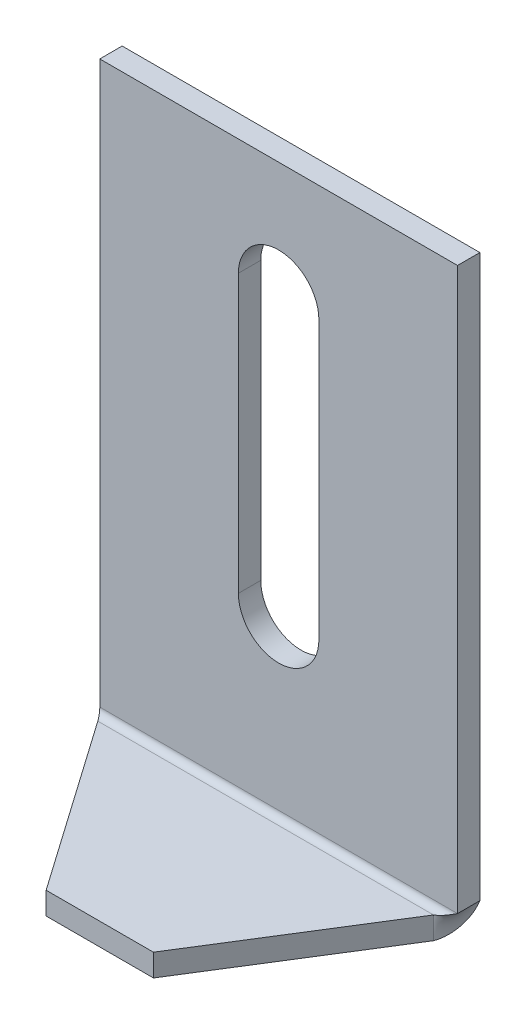
ISO-10303-21;
HEADER;
FILE_DESCRIPTION(('STEP AP214'),'2;1');
FILE_NAME('part.step','',(''),(''),'','','');
FILE_SCHEMA(('AUTOMOTIVE_DESIGN { 1 0 10303 214 1 1 1 1 }'));
ENDSEC;
DATA;
#1=APPLICATION_CONTEXT('core data for automotive mechanical design processes');
#2=APPLICATION_PROTOCOL_DEFINITION('international standard','automotive_design',2000,#1);
#3=PRODUCT_CONTEXT('',#1,'mechanical');
#4=PRODUCT('Part','Part','',(#3));
#5=PRODUCT_RELATED_PRODUCT_CATEGORY('part','',(#4));
#6=PRODUCT_DEFINITION_FORMATION('','',#4);
#7=PRODUCT_DEFINITION_CONTEXT('part definition',#1,'design');
#8=PRODUCT_DEFINITION('design','',#6,#7);
#9=PRODUCT_DEFINITION_SHAPE('','',#8);
#10=(LENGTH_UNIT() NAMED_UNIT(*) SI_UNIT(.MILLI.,.METRE.));
#11=(NAMED_UNIT(*) PLANE_ANGLE_UNIT() SI_UNIT($,.RADIAN.));
#12=(NAMED_UNIT(*) SI_UNIT($,.STERADIAN.) SOLID_ANGLE_UNIT());
#13=UNCERTAINTY_MEASURE_WITH_UNIT(LENGTH_MEASURE(1.E-05),#10,'distance_accuracy_value','');
#14=(GEOMETRIC_REPRESENTATION_CONTEXT(3) GLOBAL_UNCERTAINTY_ASSIGNED_CONTEXT((#13)) GLOBAL_UNIT_ASSIGNED_CONTEXT((#10,
#11,#12)) REPRESENTATION_CONTEXT('',''));
#15=CARTESIAN_POINT('',(0.,0.,0.));
#16=DIRECTION('',(0.,0.,1.));
#17=DIRECTION('',(1.,0.,0.));
#18=AXIS2_PLACEMENT_3D('',#15,#16,#17);
#19=CARTESIAN_POINT('',(20.,-29.7634,0.7366));
#20=DIRECTION('',(1.,0.,0.));
#21=DIRECTION('',(0.,-1.,0.));
#22=AXIS2_PLACEMENT_3D('',#19,#20,#21);
#23=CYLINDRICAL_SURFACE('',#22,3.2366);
#24=DIRECTION('',(1.,0.,0.));
#25=VECTOR('',#24,1.);
#26=CARTESIAN_POINT('',(20.,-29.7634,-2.5));
#27=LINE('',#26,#25);
#28=CARTESIAN_POINT('',(20.,-29.7634,-2.5));
#29=VERTEX_POINT('',#28);
#30=CARTESIAN_POINT('',(-20.,-29.7634,-2.5));
#31=VERTEX_POINT('',#30);
#32=EDGE_CURVE('E323',#29,#31,#27,.F.);
#33=ORIENTED_EDGE('',*,*,#32,.F.);
#34=CARTESIAN_POINT('',(20.,-29.7634,-2.5));
#35=CARTESIAN_POINT('',(19.9615623074783,-29.8635206752206,-2.50001434722235));
#36=CARTESIAN_POINT('',(19.9231257163744,-29.9636396314822,-2.49535493747329));
#37=CARTESIAN_POINT('',(19.8462557223941,-30.1630139688057,-2.47679174832859));
#38=CARTESIAN_POINT('',(19.8078223194519,-30.262269382968,-2.46288832486156));
#39=CARTESIAN_POINT('',(19.7309971081431,-30.4589609556835,-2.42595964820672));
#40=CARTESIAN_POINT('',(19.6926052985018,-30.5563989161265,-2.40294399452095));
#41=CARTESIAN_POINT('',(19.6158195325325,-30.7487216933464,-2.34799402211207));
#42=CARTESIAN_POINT('',(19.5774255763525,-30.843606612373,-2.31606006115319));
#43=CARTESIAN_POINT('',(19.5015950327425,-31.0276906188389,-2.2444500018259));
#44=CARTESIAN_POINT('',(19.4641584072125,-31.116972449602,-2.20498644045154));
#45=CARTESIAN_POINT('',(19.3892722432459,-31.2916417879416,-2.11814558430977));
#46=CARTESIAN_POINT('',(19.3518227049898,-31.3770278884105,-2.07076545850092));
#47=CARTESIAN_POINT('',(19.2769518866024,-31.5431166859465,-1.96852316681954));
#48=CARTESIAN_POINT('',(19.2395306046696,-31.6238225477047,-1.91366614279858));
#49=CARTESIAN_POINT('',(19.1646718685881,-31.7799812156769,-1.79687382559493));
#50=CARTESIAN_POINT('',(19.1272344133318,-31.8554321903026,-1.73493608410411));
#51=CARTESIAN_POINT('',(19.0523699753119,-32.0004148574565,-1.60452117556803));
#52=CARTESIAN_POINT('',(19.0149429925595,-32.0699482061477,-1.53604584965226));
#53=CARTESIAN_POINT('',(18.9400886227628,-32.2025518867596,-1.39309998730571));
#54=CARTESIAN_POINT('',(18.9026612357184,-32.2656222182564,-1.31862945048172));
#55=CARTESIAN_POINT('',(18.8277846861459,-32.3848260651348,-1.16424771158406));
#56=CARTESIAN_POINT('',(18.7903355258826,-32.4409548913771,-1.08433288768441));
#57=CARTESIAN_POINT('',(18.7154486080126,-32.5457481709002,-0.919790334514382));
#58=CARTESIAN_POINT('',(18.6780108509663,-32.5944152115861,-0.835164252830076));
#59=CARTESIAN_POINT('',(18.6030999647303,-32.6839514540244,-0.661787113500573));
#60=CARTESIAN_POINT('',(18.5656268340308,-32.7248135981518,-0.573032411848724));
#61=CARTESIAN_POINT('',(18.4906941624865,-32.7983379503189,-0.392227419429467));
#62=CARTESIAN_POINT('',(18.4532346218087,-32.8310032240005,-0.300178375512506));
#63=CARTESIAN_POINT('',(18.3783619110252,-32.8878542268053,-0.113614675891605));
#64=CARTESIAN_POINT('',(18.3409487369194,-32.9120496186919,-0.0191029628803435));
#65=CARTESIAN_POINT('',(18.2661377229835,-32.951806110206,0.171680786222593));
#66=CARTESIAN_POINT('',(18.2287398845504,-32.9673714055,0.267951943373622));
#67=CARTESIAN_POINT('',(18.1674788051567,-32.9857079667507,0.426473120620318));
#68=CARTESIAN_POINT('',(18.1436126567985,-32.9910704641397,0.48843395752415));
#69=CARTESIAN_POINT('',(18.0959187523188,-32.99821413809,0.612461043762688));
#70=CARTESIAN_POINT('',(18.0720909965556,-33.0000010949367,0.674526960353037));
#71=CARTESIAN_POINT('',(18.0482610306343,-33.,0.73660000000001));
#72=B_SPLINE_CURVE_WITH_KNOTS('',3,(#34,#35,#36,#37,#38,#39,#40,#41,#42,#43,#44,#45,#46,#47,#48,
#49,#50,#51,#52,#53,#54,#55,#56,#57,#58,#59,#60,#61,#62,#63,#64,#65,#66,#67,#68,#69,#70,#71),
.UNSPECIFIED.,.F.,.F.,(4,2,2,2,2,2,2,2,2,2,2,2,2,2,2,2,2,2,4),(0.,0.321632700777931,
0.643253018228255,0.964535414602611,1.28580492435662,1.59907625550871,1.91245985629269,
2.22562902092769,2.53890679983774,2.85209661153469,3.16528644377296,3.47868670020702,
3.79197803682578,4.10555134159481,4.41900719409226,4.73210426980757,5.04504899434633,
5.24480361178085,5.44423504042591),.UNSPECIFIED.);
#73=CARTESIAN_POINT('',(18.0482610306343,-33.,0.736600000000007));
#74=VERTEX_POINT('',#73);
#75=EDGE_CURVE('E181',#29,#74,#72,.T.);
#76=ORIENTED_EDGE('',*,*,#75,.T.);
#77=DIRECTION('',(1.,0.,0.));
#78=VECTOR('',#77,1.);
#79=CARTESIAN_POINT('',(-20.,-33.,0.736599999999988));
#80=LINE('',#79,#78);
#81=CARTESIAN_POINT('',(-19.48438,-33.,0.736599999999988));
#82=VERTEX_POINT('',#81);
#83=EDGE_CURVE('E311',#74,#82,#80,.F.);
#84=ORIENTED_EDGE('',*,*,#83,.T.);
#85=CARTESIAN_POINT('',(-19.48438,-29.7634,0.7366));
#86=DIRECTION('',(0.98754684235154,0.,-0.157325249599364));
#87=DIRECTION('',(0.157325249599364,0.,0.98754684235154));
#88=AXIS2_PLACEMENT_3D('',#85,#86,#87);
#89=ELLIPSE('',#88,3.27741415515342,3.2366);
#90=EDGE_CURVE('E341',#31,#82,#89,.F.);
#91=ORIENTED_EDGE('',*,*,#90,.F.);
#92=EDGE_LOOP('',(#33,#76,#84,#91));
#93=FACE_BOUND('',#92,.T.);
#94=ADVANCED_FACE('F58',(#93),#23,.T.);
#95=CARTESIAN_POINT('',(20.,-29.7634,0.7366));
#96=DIRECTION('',(1.,0.,0.));
#97=DIRECTION('',(0.,-1.,0.));
#98=AXIS2_PLACEMENT_3D('',#95,#96,#97);
#99=CYLINDRICAL_SURFACE('',#98,0.7366);
#100=CARTESIAN_POINT('',(20.,-29.7634,0.));
#101=CARTESIAN_POINT('',(19.9310524712027,-29.804276808167,-3.40600880367663E-05));
#102=CARTESIAN_POINT('',(19.8621064379867,-29.8451463476469,0.00340052086237688));
#103=CARTESIAN_POINT('',(19.7242256496072,-29.9257551094893,0.0169633811287723));
#104=CARTESIAN_POINT('',(19.6552908943644,-29.9654945074389,0.0270906146336669));
#105=CARTESIAN_POINT('',(19.5175536439035,-30.0426654622591,0.0537693367474229));
#106=CARTESIAN_POINT('',(19.4487511525299,-30.0801013624259,0.0703082772177428));
#107=CARTESIAN_POINT('',(19.3111544757805,-30.1517247501937,0.109347590895923));
#108=CARTESIAN_POINT('',(19.2423602901782,-30.1859124946601,0.131847492174927));
#109=CARTESIAN_POINT('',(19.1043588210408,-30.2502850760953,0.182338114696372));
#110=CARTESIAN_POINT('',(19.0351515196128,-30.2804448360086,0.210360768297003));
#111=CARTESIAN_POINT('',(18.8967386595313,-30.3356857081223,0.271034207694493));
#112=CARTESIAN_POINT('',(18.827533100874,-30.360766832386,0.30368498249786));
#113=CARTESIAN_POINT('',(18.689258170966,-30.4051048084741,0.372633775244736));
#114=CARTESIAN_POINT('',(18.6201887983694,-30.4243729676954,0.408924526957045));
#115=CARTESIAN_POINT('',(18.4820768903853,-30.456610819514,0.484185384271051));
#116=CARTESIAN_POINT('',(18.4130343576726,-30.4695834732213,0.523154220361849));
#117=CARTESIAN_POINT('',(18.2946987051323,-30.4861245346357,0.591330268276077));
#118=CARTESIAN_POINT('',(18.2454003544586,-30.4913210123019,0.620144539788254));
#119=CARTESIAN_POINT('',(18.1468237529499,-30.4982619511991,0.678171957847934));
#120=CARTESIAN_POINT('',(18.0975455024463,-30.5000078737198,0.707384930268018));
#121=CARTESIAN_POINT('',(18.0482610306343,-30.5,0.736600000000002));
#122=B_SPLINE_CURVE_WITH_KNOTS('',3,(#100,#101,#102,#103,#104,#105,#106,#107,#108,#109,#110,
#111,#112,#113,#114,#115,#116,#117,#118,#119,#120,#121),.UNSPECIFIED.,.F.,.F.,(4,2,2,2,2,2,2,2,
2,2,4),(0.,0.240381665537412,0.480725777297071,0.720601874987007,0.960458987374965,
1.2017459376617,1.44303231481264,1.68384626897519,1.92454684551892,2.09645954323323,
2.26829942132417),.UNSPECIFIED.);
#123=CARTESIAN_POINT('',(20.,-29.7634,0.));
#124=VERTEX_POINT('',#123);
#125=CARTESIAN_POINT('',(18.0482610306343,-30.5,0.73660000000001));
#126=VERTEX_POINT('',#125);
#127=EDGE_CURVE('E198',#124,#126,#122,.T.);
#128=ORIENTED_EDGE('',*,*,#127,.F.);
#129=DIRECTION('',(1.,0.,0.));
#130=VECTOR('',#129,1.);
#131=CARTESIAN_POINT('',(20.,-29.7634,0.));
#132=LINE('',#131,#130);
#133=CARTESIAN_POINT('',(-20.,-29.7634,0.));
#134=VERTEX_POINT('',#133);
#135=EDGE_CURVE('E327',#124,#134,#132,.F.);
#136=ORIENTED_EDGE('',*,*,#135,.T.);
#137=CARTESIAN_POINT('',(-19.48438,-29.7634,0.7366));
#138=DIRECTION('',(0.819231920519041,0.,-0.573462344363328));
#139=DIRECTION('',(0.573462344363328,0.,0.819231920519041));
#140=AXIS2_PLACEMENT_3D('',#137,#138,#139);
#141=ELLIPSE('',#140,0.899134886654945,0.7366);
#142=CARTESIAN_POINT('',(-19.48438,-30.5,0.736599999999997));
#143=VERTEX_POINT('',#142);
#144=EDGE_CURVE('E184',#134,#143,#141,.F.);
#145=ORIENTED_EDGE('',*,*,#144,.T.);
#146=DIRECTION('',(1.,0.,0.));
#147=VECTOR('',#146,1.);
#148=CARTESIAN_POINT('',(-20.,-30.5,0.736599999999997));
#149=LINE('',#148,#147);
#150=EDGE_CURVE('E319',#143,#126,#149,.T.);
#151=ORIENTED_EDGE('',*,*,#150,.T.);
#152=EDGE_LOOP('',(#128,#136,#145,#151));
#153=FACE_BOUND('',#152,.T.);
#154=ADVANCED_FACE('F250',(#153),#99,.F.);
#155=CARTESIAN_POINT('',(0.,-33.,-1.23220452761577E-13));
#156=DIRECTION('',(0.,1.,0.));
#157=DIRECTION('',(0.,0.,1.));
#158=AXIS2_PLACEMENT_3D('',#155,#156,#157);
#159=PLANE('',#158);
#160=DIRECTION('',(0.530272237036283,0.,-0.847827432104279));
#161=VECTOR('',#160,1.);
#162=CARTESIAN_POINT('',(5.99999999999999,-32.9999999999999,20.));
#163=LINE('',#162,#161);
#164=CARTESIAN_POINT('',(6.00000000000001,-33.0000000000001,20.));
#165=VERTEX_POINT('',#164);
#166=EDGE_CURVE('E193',#165,#74,#163,.T.);
#167=ORIENTED_EDGE('',*,*,#166,.F.);
#168=DIRECTION('',(-1.,0.,0.));
#169=VECTOR('',#168,1.);
#170=CARTESIAN_POINT('',(0.,-33.0000000000001,20.));
#171=LINE('',#170,#169);
#172=CARTESIAN_POINT('',(-6.00000000000001,-33.0000000000001,20.));
#173=VERTEX_POINT('',#172);
#174=EDGE_CURVE('E310',#165,#173,#171,.T.);
#175=ORIENTED_EDGE('',*,*,#174,.T.);
#176=DIRECTION('',(-0.573462344363328,0.,-0.819231920519041));
#177=VECTOR('',#176,1.);
#178=CARTESIAN_POINT('',(-13.4228187919464,-33.,9.39597315436233));
#179=LINE('',#178,#177);
#180=EDGE_CURVE('E175',#173,#82,#179,.T.);
#181=ORIENTED_EDGE('',*,*,#180,.T.);
#182=ORIENTED_EDGE('',*,*,#83,.F.);
#183=EDGE_LOOP('',(#167,#175,#181,#182));
#184=FACE_BOUND('',#183,.T.);
#185=ADVANCED_FACE('F256',(#184),#159,.F.);
#186=CARTESIAN_POINT('',(0.,-30.5,-1.14491749414469E-13));
#187=DIRECTION('',(0.,1.,0.));
#188=DIRECTION('',(0.,0.,1.));
#189=AXIS2_PLACEMENT_3D('',#186,#187,#188);
#190=PLANE('',#189);
#191=DIRECTION('',(1.,0.,0.));
#192=VECTOR('',#191,1.);
#193=CARTESIAN_POINT('',(-20.,-30.5000000000001,20.));
#194=LINE('',#193,#192);
#195=CARTESIAN_POINT('',(6.00000000000001,-30.5000000000001,20.));
#196=VERTEX_POINT('',#195);
#197=CARTESIAN_POINT('',(-6.00000000000001,-30.5000000000001,20.));
#198=VERTEX_POINT('',#197);
#199=EDGE_CURVE('E306',#196,#198,#194,.F.);
#200=ORIENTED_EDGE('',*,*,#199,.F.);
#201=DIRECTION('',(0.530272237036283,0.,-0.847827432104279));
#202=VECTOR('',#201,1.);
#203=CARTESIAN_POINT('',(5.99999999999999,-30.4999999999999,20.));
#204=LINE('',#203,#202);
#205=EDGE_CURVE('E185',#196,#126,#204,.T.);
#206=ORIENTED_EDGE('',*,*,#205,.T.);
#207=ORIENTED_EDGE('',*,*,#150,.F.);
#208=DIRECTION('',(-0.573462344363328,0.,-0.819231920519041));
#209=VECTOR('',#208,1.);
#210=CARTESIAN_POINT('',(-13.4228187919464,-30.5,9.39597315436234));
#211=LINE('',#210,#209);
#212=EDGE_CURVE('E179',#198,#143,#211,.T.);
#213=ORIENTED_EDGE('',*,*,#212,.F.);
#214=EDGE_LOOP('',(#200,#206,#207,#213));
#215=FACE_BOUND('',#214,.T.);
#216=ADVANCED_FACE('F352',(#215),#190,.T.);
#217=CARTESIAN_POINT('',(-20.,-33.0000000000001,20.));
#218=DIRECTION('',(0.,0.,-1.));
#219=DIRECTION('',(0.,1.,0.));
#220=AXIS2_PLACEMENT_3D('',#217,#218,#219);
#221=PLANE('',#220);
#222=DIRECTION('',(0.,-1.,0.));
#223=VECTOR('',#222,1.);
#224=CARTESIAN_POINT('',(5.99999999999999,-33.0000000000001,20.));
#225=LINE('',#224,#223);
#226=EDGE_CURVE('E188',#165,#196,#225,.F.);
#227=ORIENTED_EDGE('',*,*,#226,.T.);
#228=ORIENTED_EDGE('',*,*,#199,.T.);
#229=DIRECTION('',(0.,1.,0.));
#230=VECTOR('',#229,1.);
#231=CARTESIAN_POINT('',(-6.00000000000001,-33.0000000000001,20.));
#232=LINE('',#231,#230);
#233=EDGE_CURVE('E178',#198,#173,#232,.F.);
#234=ORIENTED_EDGE('',*,*,#233,.T.);
#235=ORIENTED_EDGE('',*,*,#174,.F.);
#236=EDGE_LOOP('',(#227,#228,#234,#235));
#237=FACE_BOUND('',#236,.T.);
#238=ADVANCED_FACE('F261',(#237),#221,.F.);
#239=CARTESIAN_POINT('',(20.,-33.,-2.5));
#240=DIRECTION('',(1.,0.,0.));
#241=DIRECTION('',(0.,0.,-1.));
#242=AXIS2_PLACEMENT_3D('',#239,#240,#241);
#243=PLANE('',#242);
#244=DIRECTION('',(0.,1.,0.));
#245=VECTOR('',#244,1.);
#246=CARTESIAN_POINT('',(20.,-33.,0.));
#247=LINE('',#246,#245);
#248=CARTESIAN_POINT('',(20.,33.,0.));
#249=VERTEX_POINT('',#248);
#250=EDGE_CURVE('E294',#124,#249,#247,.T.);
#251=ORIENTED_EDGE('',*,*,#250,.F.);
#252=DIRECTION('',(0.,0.,-1.));
#253=VECTOR('',#252,1.);
#254=CARTESIAN_POINT('',(20.,-29.7634,0.));
#255=LINE('',#254,#253);
#256=EDGE_CURVE('E326',#124,#29,#255,.T.);
#257=ORIENTED_EDGE('',*,*,#256,.T.);
#258=DIRECTION('',(0.,1.,0.));
#259=VECTOR('',#258,1.);
#260=CARTESIAN_POINT('',(20.,-33.,-2.5));
#261=LINE('',#260,#259);
#262=CARTESIAN_POINT('',(20.,33.,-2.5));
#263=VERTEX_POINT('',#262);
#264=EDGE_CURVE('E296',#29,#263,#261,.T.);
#265=ORIENTED_EDGE('',*,*,#264,.T.);
#266=DIRECTION('',(0.,0.,1.));
#267=VECTOR('',#266,1.);
#268=CARTESIAN_POINT('',(20.,33.,-2.5));
#269=LINE('',#268,#267);
#270=EDGE_CURVE('E287',#263,#249,#269,.T.);
#271=ORIENTED_EDGE('',*,*,#270,.T.);
#272=EDGE_LOOP('',(#251,#257,#265,#271));
#273=FACE_BOUND('',#272,.T.);
#274=ADVANCED_FACE('F60',(#273),#243,.T.);
#275=CARTESIAN_POINT('',(0.,0.,-2.5));
#276=DIRECTION('',(0.,0.,-1.));
#277=DIRECTION('',(-1.,0.,0.));
#278=AXIS2_PLACEMENT_3D('',#275,#276,#277);
#279=PLANE('',#278);
#280=CARTESIAN_POINT('',(0.,20.,-2.5));
#281=DIRECTION('',(0.,0.,1.));
#282=DIRECTION('',(1.,0.,0.));
#283=AXIS2_PLACEMENT_3D('',#280,#281,#282);
#284=CIRCLE('',#283,4.5);
#285=CARTESIAN_POINT('',(4.5,20.,-2.5));
#286=VERTEX_POINT('',#285);
#287=CARTESIAN_POINT('',(-4.5,20.,-2.5));
#288=VERTEX_POINT('',#287);
#289=EDGE_CURVE('E150',#286,#288,#284,.T.);
#290=ORIENTED_EDGE('',*,*,#289,.T.);
#291=DIRECTION('',(0.,-1.,0.));
#292=VECTOR('',#291,1.);
#293=CARTESIAN_POINT('',(-4.5,20.,-2.5));
#294=LINE('',#293,#292);
#295=CARTESIAN_POINT('',(-4.5,-11.,-2.5));
#296=VERTEX_POINT('',#295);
#297=EDGE_CURVE('E157',#288,#296,#294,.T.);
#298=ORIENTED_EDGE('',*,*,#297,.T.);
#299=CARTESIAN_POINT('',(0.,-11.,-2.5));
#300=DIRECTION('',(0.,0.,1.));
#301=DIRECTION('',(1.,0.,0.));
#302=AXIS2_PLACEMENT_3D('',#299,#300,#301);
#303=CIRCLE('',#302,4.5);
#304=CARTESIAN_POINT('',(4.5,-11.,-2.5));
#305=VERTEX_POINT('',#304);
#306=EDGE_CURVE('E73',#296,#305,#303,.T.);
#307=ORIENTED_EDGE('',*,*,#306,.T.);
#308=DIRECTION('',(0.,1.,0.));
#309=VECTOR('',#308,1.);
#310=CARTESIAN_POINT('',(4.5,20.,-2.5));
#311=LINE('',#310,#309);
#312=EDGE_CURVE('E154',#305,#286,#311,.T.);
#313=ORIENTED_EDGE('',*,*,#312,.T.);
#314=EDGE_LOOP('',(#290,#298,#307,#313));
#315=FACE_BOUND('',#314,.T.);
#316=ORIENTED_EDGE('',*,*,#264,.F.);
#317=ORIENTED_EDGE('',*,*,#32,.T.);
#318=DIRECTION('',(0.,-1.,0.));
#319=VECTOR('',#318,1.);
#320=CARTESIAN_POINT('',(-20.,-33.,-2.5));
#321=LINE('',#320,#319);
#322=CARTESIAN_POINT('',(-20.,33.,-2.5));
#323=VERTEX_POINT('',#322);
#324=EDGE_CURVE('E305',#323,#31,#321,.T.);
#325=ORIENTED_EDGE('',*,*,#324,.F.);
#326=DIRECTION('',(-1.,0.,0.));
#327=VECTOR('',#326,1.);
#328=CARTESIAN_POINT('',(-20.,33.,-2.5));
#329=LINE('',#328,#327);
#330=EDGE_CURVE('E334',#263,#323,#329,.T.);
#331=ORIENTED_EDGE('',*,*,#330,.F.);
#332=EDGE_LOOP('',(#316,#317,#325,#331));
#333=FACE_BOUND('',#332,.T.);
#334=ADVANCED_FACE('F161',(#315,#333),#279,.T.);
#335=CARTESIAN_POINT('',(0.,0.,0.));
#336=DIRECTION('',(0.,0.,-1.));
#337=DIRECTION('',(-1.,0.,0.));
#338=AXIS2_PLACEMENT_3D('',#335,#336,#337);
#339=PLANE('',#338);
#340=DIRECTION('',(0.,1.,0.));
#341=VECTOR('',#340,1.);
#342=CARTESIAN_POINT('',(-4.5,0.,0.));
#343=LINE('',#342,#341);
#344=CARTESIAN_POINT('',(-4.5,-11.,0.));
#345=VERTEX_POINT('',#344);
#346=CARTESIAN_POINT('',(-4.5,20.,0.));
#347=VERTEX_POINT('',#346);
#348=EDGE_CURVE('E303',#345,#347,#343,.T.);
#349=ORIENTED_EDGE('',*,*,#348,.T.);
#350=CARTESIAN_POINT('',(0.,20.,0.));
#351=DIRECTION('',(0.,0.,-1.));
#352=DIRECTION('',(-1.,0.,0.));
#353=AXIS2_PLACEMENT_3D('',#350,#351,#352);
#354=CIRCLE('',#353,4.5);
#355=CARTESIAN_POINT('',(4.5,20.,0.));
#356=VERTEX_POINT('',#355);
#357=EDGE_CURVE('E13',#347,#356,#354,.T.);
#358=ORIENTED_EDGE('',*,*,#357,.T.);
#359=DIRECTION('',(0.,-1.,0.));
#360=VECTOR('',#359,1.);
#361=CARTESIAN_POINT('',(4.5,0.,0.));
#362=LINE('',#361,#360);
#363=CARTESIAN_POINT('',(4.5,-11.,0.));
#364=VERTEX_POINT('',#363);
#365=EDGE_CURVE('E66',#356,#364,#362,.T.);
#366=ORIENTED_EDGE('',*,*,#365,.T.);
#367=CARTESIAN_POINT('',(0.,-11.,0.));
#368=DIRECTION('',(0.,0.,-1.));
#369=DIRECTION('',(-1.,0.,0.));
#370=AXIS2_PLACEMENT_3D('',#367,#368,#369);
#371=CIRCLE('',#370,4.5);
#372=EDGE_CURVE('E519',#364,#345,#371,.T.);
#373=ORIENTED_EDGE('',*,*,#372,.T.);
#374=EDGE_LOOP('',(#349,#358,#366,#373));
#375=FACE_BOUND('',#374,.T.);
#376=ORIENTED_EDGE('',*,*,#135,.F.);
#377=ORIENTED_EDGE('',*,*,#250,.T.);
#378=DIRECTION('',(-1.,0.,0.));
#379=VECTOR('',#378,1.);
#380=CARTESIAN_POINT('',(-20.,33.,0.));
#381=LINE('',#380,#379);
#382=CARTESIAN_POINT('',(-20.,33.,0.));
#383=VERTEX_POINT('',#382);
#384=EDGE_CURVE('E284',#249,#383,#381,.T.);
#385=ORIENTED_EDGE('',*,*,#384,.T.);
#386=DIRECTION('',(0.,-1.,0.));
#387=VECTOR('',#386,1.);
#388=CARTESIAN_POINT('',(-20.,-33.,0.));
#389=LINE('',#388,#387);
#390=EDGE_CURVE('E293',#383,#134,#389,.T.);
#391=ORIENTED_EDGE('',*,*,#390,.T.);
#392=EDGE_LOOP('',(#376,#377,#385,#391));
#393=FACE_BOUND('',#392,.T.);
#394=ADVANCED_FACE('F266',(#375,#393),#339,.F.);
#395=CARTESIAN_POINT('',(-20.,-33.,-2.5));
#396=DIRECTION('',(-1.,0.,0.));
#397=DIRECTION('',(0.,0.,1.));
#398=AXIS2_PLACEMENT_3D('',#395,#396,#397);
#399=PLANE('',#398);
#400=DIRECTION('',(0.,0.,-1.));
#401=VECTOR('',#400,1.);
#402=CARTESIAN_POINT('',(-20.,-29.7634,0.));
#403=LINE('',#402,#401);
#404=EDGE_CURVE('E298',#134,#31,#403,.T.);
#405=ORIENTED_EDGE('',*,*,#404,.F.);
#406=ORIENTED_EDGE('',*,*,#390,.F.);
#407=DIRECTION('',(0.,0.,1.));
#408=VECTOR('',#407,1.);
#409=CARTESIAN_POINT('',(-20.,33.,-2.5));
#410=LINE('',#409,#408);
#411=EDGE_CURVE('E289',#323,#383,#410,.T.);
#412=ORIENTED_EDGE('',*,*,#411,.F.);
#413=ORIENTED_EDGE('',*,*,#324,.T.);
#414=EDGE_LOOP('',(#405,#406,#412,#413));
#415=FACE_BOUND('',#414,.T.);
#416=ADVANCED_FACE('F269',(#415),#399,.T.);
#417=CARTESIAN_POINT('',(-20.,33.,-2.5));
#418=DIRECTION('',(0.,1.,0.));
#419=DIRECTION('',(0.,0.,1.));
#420=AXIS2_PLACEMENT_3D('',#417,#418,#419);
#421=PLANE('',#420);
#422=ORIENTED_EDGE('',*,*,#384,.F.);
#423=ORIENTED_EDGE('',*,*,#270,.F.);
#424=ORIENTED_EDGE('',*,*,#330,.T.);
#425=ORIENTED_EDGE('',*,*,#411,.T.);
#426=EDGE_LOOP('',(#422,#423,#424,#425));
#427=FACE_BOUND('',#426,.T.);
#428=ADVANCED_FACE('F272',(#427),#421,.T.);
#429=CARTESIAN_POINT('',(-18.96876,-29.7634,3.9732));
#430=CARTESIAN_POINT('',(-18.96876,-29.7634,3.13986666666667));
#431=CARTESIAN_POINT('',(-18.96876,-29.7634,2.30653333333333));
#432=CARTESIAN_POINT('',(-18.96876,-29.7634,1.4732));
#433=CARTESIAN_POINT('',(-18.96876,-23.2902,3.97320000000003));
#434=CARTESIAN_POINT('',(-18.96876,-24.9568666666667,3.13986666666669));
#435=CARTESIAN_POINT('',(-18.96876,-26.6235333333334,2.30653333333335));
#436=CARTESIAN_POINT('',(-18.96876,-28.2902,1.47320000000001));
#437=CARTESIAN_POINT('',(-20.,-23.2902,-2.49999999999997));
#438=CARTESIAN_POINT('',(-20.,-24.9568666666667,-1.66666666666665));
#439=CARTESIAN_POINT('',(-20.,-26.6235333333333,-0.833333333333321));
#440=CARTESIAN_POINT('',(-20.,-28.2902,0.));
#441=CARTESIAN_POINT('',(-20.,-29.7634,-2.5));
#442=CARTESIAN_POINT('',(-20.,-29.7634,-1.66666666666667));
#443=CARTESIAN_POINT('',(-20.,-29.7634,-0.833333333333334));
#444=CARTESIAN_POINT('',(-20.,-29.7634,0.));
#445=CARTESIAN_POINT('',(-20.,-36.2366,-2.50000000000003));
#446=CARTESIAN_POINT('',(-20.,-34.5699333333333,-1.66666666666669));
#447=CARTESIAN_POINT('',(-20.,-32.9032666666667,-0.833333333333347));
#448=CARTESIAN_POINT('',(-20.,-31.2366,0.));
#449=CARTESIAN_POINT('',(-18.96876,-36.2366,3.97319999999997));
#450=CARTESIAN_POINT('',(-18.96876,-34.5699333333334,3.13986666666665));
#451=CARTESIAN_POINT('',(-18.96876,-32.9032666666667,2.30653333333332));
#452=CARTESIAN_POINT('',(-18.96876,-31.2366,1.47319999999999));
#453=CARTESIAN_POINT('',(-18.96876,-29.7634,3.9732));
#454=CARTESIAN_POINT('',(-18.96876,-29.7634,3.13986666666667));
#455=CARTESIAN_POINT('',(-18.96876,-29.7634,2.30653333333333));
#456=CARTESIAN_POINT('',(-18.96876,-29.7634,1.4732));
#457=(BOUNDED_SURFACE() B_SPLINE_SURFACE(3,3,((#429,#430,#431,#432),(#433,#434,#435,#436),(#437,
#438,#439,#440),(#441,#442,#443,#444),(#445,#446,#447,#448),(#449,#450,#451,#452),(#453,#454,
#455,#456)),.UNSPECIFIED.,.T.,.F.,.F.) B_SPLINE_SURFACE_WITH_KNOTS((4,3,4),(4,4),(0.,0.5,1.),
(0.,1.),.UNSPECIFIED.) GEOMETRIC_REPRESENTATION_ITEM() RATIONAL_B_SPLINE_SURFACE(((1.,1.,1.,1.),
(0.333333333333333,0.333333333333333,0.333333333333333,0.333333333333333),(0.333333333333333,
0.333333333333333,0.333333333333333,0.333333333333333),(1.,1.,1.,1.),(0.333333333333333,
0.333333333333333,0.333333333333333,0.333333333333333),(0.333333333333333,0.333333333333333,
0.333333333333333,0.333333333333333),(1.,1.,1.,1.))) REPRESENTATION_ITEM('') SURFACE());
#458=DIRECTION('',(0.,-1.,0.));
#459=VECTOR('',#458,1.);
#460=CARTESIAN_POINT('',(-19.48438,-33.,0.736599999999988));
#461=LINE('',#460,#459);
#462=EDGE_CURVE('E322',#82,#143,#461,.F.);
#463=ORIENTED_EDGE('',*,*,#462,.T.);
#464=ORIENTED_EDGE('',*,*,#144,.F.);
#465=ORIENTED_EDGE('',*,*,#404,.T.);
#466=ORIENTED_EDGE('',*,*,#90,.T.);
#467=EDGE_LOOP('',(#463,#464,#465,#466));
#468=FACE_BOUND('',#467,.T.);
#469=ADVANCED_FACE('F235',(#468),#457,.T.);
#470=CARTESIAN_POINT('',(-13.4228187919464,-33.,9.39597315436233));
#471=DIRECTION('',(0.819231920519041,0.,-0.573462344363328));
#472=DIRECTION('',(-0.573462344363328,0.,-0.819231920519041));
#473=AXIS2_PLACEMENT_3D('',#470,#471,#472);
#474=PLANE('',#473);
#475=ORIENTED_EDGE('',*,*,#233,.F.);
#476=ORIENTED_EDGE('',*,*,#212,.T.);
#477=ORIENTED_EDGE('',*,*,#462,.F.);
#478=ORIENTED_EDGE('',*,*,#180,.F.);
#479=EDGE_LOOP('',(#475,#476,#477,#478));
#480=FACE_BOUND('',#479,.T.);
#481=ADVANCED_FACE('F222',(#480),#474,.F.);
#482=CARTESIAN_POINT('',(20.,-29.7634,-2.525));
#483=CARTESIAN_POINT('',(19.8373293487332,-30.1904096371697,-2.525));
#484=CARTESIAN_POINT('',(19.6747101717724,-30.6171168996262,-2.44010928222138));
#485=CARTESIAN_POINT('',(19.3494203435448,-31.4060036663777,-2.11334168425625));
#486=CARTESIAN_POINT('',(19.186775429431,-31.7678055818702,-1.8715933731659));
#487=CARTESIAN_POINT('',(18.8614856012033,-32.3715933731659,-1.26780558187018));
#488=CARTESIAN_POINT('',(18.6988406870895,-32.6133416842563,-0.906003666377719));
#489=CARTESIAN_POINT('',(18.3735508588619,-32.9401092822214,-0.117116899626219));
#490=CARTESIAN_POINT('',(18.2109316819011,-33.025,0.309590362830277));
#491=CARTESIAN_POINT('',(18.0482610306343,-33.025,0.73660000000001));
#492=CARTESIAN_POINT('',(20.,-29.7634,-2.5));
#493=CARTESIAN_POINT('',(19.8373295280527,-30.1871365242807,-2.5));
#494=CARTESIAN_POINT('',(19.6747101717724,-30.6105732025173,-2.41575996530467));
#495=CARTESIAN_POINT('',(19.3494203435448,-31.3934131918685,-2.09149702454739));
#496=CARTESIAN_POINT('',(19.186775429431,-31.7524419138708,-1.85160170210595));
#497=CARTESIAN_POINT('',(18.8614856012033,-32.351601702106,-1.25244191387081));
#498=CARTESIAN_POINT('',(18.6988406870895,-32.5914970245474,-0.893413191868447));
#499=CARTESIAN_POINT('',(18.3735508588619,-32.9157599653047,-0.110573202517237));
#500=CARTESIAN_POINT('',(18.2109315025816,-33.,0.312863475719304));
#501=CARTESIAN_POINT('',(18.0482610306343,-33.,0.73660000000001));
#502=CARTESIAN_POINT('',(20.,-29.7634,0.));
#503=CARTESIAN_POINT('',(19.8373474599988,-29.8598252353779,0.));
#504=CARTESIAN_POINT('',(19.6747101717724,-29.9562034916191,0.0191717263661178));
#505=CARTESIAN_POINT('',(19.3494203435448,-30.1343657409412,0.0929689463382529));
#506=CARTESIAN_POINT('',(19.186775429431,-30.2160751139335,0.147565403889499));
#507=CARTESIAN_POINT('',(18.8614856012033,-30.3524345961105,0.283924886066477));
#508=CARTESIAN_POINT('',(18.6988406870895,-30.4070310536618,0.365634259058797));
#509=CARTESIAN_POINT('',(18.3735508588619,-30.4808282736339,0.543796508380956));
#510=CARTESIAN_POINT('',(18.2109135706354,-30.5,0.640174764622061));
#511=CARTESIAN_POINT('',(18.0482610306343,-30.5,0.736600000000002));
#512=CARTESIAN_POINT('',(20.,-29.7634,0.0252499999999991));
#513=CARTESIAN_POINT('',(19.8373476411115,-29.85651939136,0.0252499999999991));
#514=CARTESIAN_POINT('',(19.6747101717724,-29.949594357539,0.0437645364519927));
#515=CARTESIAN_POINT('',(19.3494203435448,-30.1216493616868,0.115032052644198));
#516=CARTESIAN_POINT('',(19.186775429431,-30.2005578092542,0.167756991660053));
#517=CARTESIAN_POINT('',(18.8614856012033,-30.33224300834,0.299442190745844));
#518=CARTESIAN_POINT('',(18.6988406870895,-30.3849679473558,0.378350638313162));
#519=CARTESIAN_POINT('',(18.3735508588619,-30.456235463548,0.550405642461028));
#520=CARTESIAN_POINT('',(18.2109133895228,-30.47475,0.643480608639979));
#521=CARTESIAN_POINT('',(18.0482610306343,-30.47475,0.736600000000002));
#522=B_SPLINE_SURFACE_WITH_KNOTS('',1,3,((#482,#483,#484,#485,#486,#487,#488,#489,#490,#491),
(#492,#493,#494,#495,#496,#497,#498,#499,#500,#501),(#502,#503,#504,#505,#506,#507,#508,#509,
#510,#511),(#512,#513,#514,#515,#516,#517,#518,#519,#520,#521)),.UNSPECIFIED.,.F.,.F.,.F.,(2,1,
1,2),(4,2,2,2,4),(-0.01,0.,1.,1.0101),(0.,0.25,0.5,0.75,1.),.UNSPECIFIED.);
#523=DIRECTION('',(0.,-1.,0.));
#524=VECTOR('',#523,1.);
#525=CARTESIAN_POINT('',(18.0482610306343,-30.5,0.736600000000018));
#526=LINE('',#525,#524);
#527=EDGE_CURVE('E170',#126,#74,#526,.T.);
#528=ORIENTED_EDGE('',*,*,#256,.F.);
#529=ORIENTED_EDGE('',*,*,#127,.T.);
#530=ORIENTED_EDGE('',*,*,#527,.T.);
#531=ORIENTED_EDGE('',*,*,#75,.F.);
#532=EDGE_LOOP('',(#528,#529,#530,#531));
#533=FACE_BOUND('',#532,.T.);
#534=ADVANCED_FACE('F215',(#533),#522,.T.);
#535=CARTESIAN_POINT('',(5.99999999999999,-30.4999999999999,20.));
#536=DIRECTION('',(-0.847827432104279,0.,-0.530272237036283));
#537=DIRECTION('',(0.530272237036283,0.,-0.847827432104279));
#538=AXIS2_PLACEMENT_3D('',#535,#536,#537);
#539=PLANE('',#538);
#540=ORIENTED_EDGE('',*,*,#527,.F.);
#541=ORIENTED_EDGE('',*,*,#205,.F.);
#542=ORIENTED_EDGE('',*,*,#226,.F.);
#543=ORIENTED_EDGE('',*,*,#166,.T.);
#544=EDGE_LOOP('',(#540,#541,#542,#543));
#545=FACE_BOUND('',#544,.T.);
#546=ADVANCED_FACE('F221',(#545),#539,.F.);
#547=CARTESIAN_POINT('',(0.,20.,-2.5));
#548=DIRECTION('',(0.,0.,1.));
#549=DIRECTION('',(1.,0.,0.));
#550=AXIS2_PLACEMENT_3D('',#547,#548,#549);
#551=CYLINDRICAL_SURFACE('',#550,4.5);
#552=DIRECTION('',(0.,0.,1.));
#553=VECTOR('',#552,1.);
#554=CARTESIAN_POINT('',(-4.5,20.,-2.5));
#555=LINE('',#554,#553);
#556=EDGE_CURVE('E81',#288,#347,#555,.T.);
#557=ORIENTED_EDGE('',*,*,#556,.F.);
#558=ORIENTED_EDGE('',*,*,#289,.F.);
#559=DIRECTION('',(0.,0.,1.));
#560=VECTOR('',#559,1.);
#561=CARTESIAN_POINT('',(4.5,20.,-2.5));
#562=LINE('',#561,#560);
#563=EDGE_CURVE('E168',#286,#356,#562,.T.);
#564=ORIENTED_EDGE('',*,*,#563,.T.);
#565=ORIENTED_EDGE('',*,*,#357,.F.);
#566=EDGE_LOOP('',(#557,#558,#564,#565));
#567=FACE_BOUND('',#566,.T.);
#568=ADVANCED_FACE('F147',(#567),#551,.F.);
#569=CARTESIAN_POINT('',(4.5,20.,-2.5));
#570=DIRECTION('',(1.,0.,0.));
#571=DIRECTION('',(0.,1.,0.));
#572=AXIS2_PLACEMENT_3D('',#569,#570,#571);
#573=PLANE('',#572);
#574=ORIENTED_EDGE('',*,*,#563,.F.);
#575=ORIENTED_EDGE('',*,*,#312,.F.);
#576=DIRECTION('',(0.,0.,1.));
#577=VECTOR('',#576,1.);
#578=CARTESIAN_POINT('',(4.5,-11.,-2.5));
#579=LINE('',#578,#577);
#580=EDGE_CURVE('E171',#305,#364,#579,.T.);
#581=ORIENTED_EDGE('',*,*,#580,.T.);
#582=ORIENTED_EDGE('',*,*,#365,.F.);
#583=EDGE_LOOP('',(#574,#575,#581,#582));
#584=FACE_BOUND('',#583,.T.);
#585=ADVANCED_FACE('F239',(#584),#573,.F.);
#586=CARTESIAN_POINT('',(0.,-11.,-2.5));
#587=DIRECTION('',(0.,0.,1.));
#588=DIRECTION('',(1.,0.,0.));
#589=AXIS2_PLACEMENT_3D('',#586,#587,#588);
#590=CYLINDRICAL_SURFACE('',#589,4.5);
#591=ORIENTED_EDGE('',*,*,#580,.F.);
#592=ORIENTED_EDGE('',*,*,#306,.F.);
#593=DIRECTION('',(0.,0.,1.));
#594=VECTOR('',#593,1.);
#595=CARTESIAN_POINT('',(-4.5,-11.,-2.5));
#596=LINE('',#595,#594);
#597=EDGE_CURVE('E153',#296,#345,#596,.T.);
#598=ORIENTED_EDGE('',*,*,#597,.T.);
#599=ORIENTED_EDGE('',*,*,#372,.F.);
#600=EDGE_LOOP('',(#591,#592,#598,#599));
#601=FACE_BOUND('',#600,.T.);
#602=ADVANCED_FACE('F242',(#601),#590,.F.);
#603=CARTESIAN_POINT('',(-4.5,20.,-2.5));
#604=DIRECTION('',(-1.,0.,0.));
#605=DIRECTION('',(0.,-1.,0.));
#606=AXIS2_PLACEMENT_3D('',#603,#604,#605);
#607=PLANE('',#606);
#608=ORIENTED_EDGE('',*,*,#597,.F.);
#609=ORIENTED_EDGE('',*,*,#297,.F.);
#610=ORIENTED_EDGE('',*,*,#556,.T.);
#611=ORIENTED_EDGE('',*,*,#348,.F.);
#612=EDGE_LOOP('',(#608,#609,#610,#611));
#613=FACE_BOUND('',#612,.T.);
#614=ADVANCED_FACE('F158',(#613),#607,.F.);
#615=CLOSED_SHELL('',(#94,#154,#185,#216,#238,#274,#334,#394,#416,#428,#469,#481,#534,#546,#568,
#585,#602,#614));
#616=MANIFOLD_SOLID_BREP('B2',#615);
#617=ADVANCED_BREP_SHAPE_REPRESENTATION('',(#18,#616),#14);
#618=SHAPE_DEFINITION_REPRESENTATION(#9,#617);
ENDSEC;
END-ISO-10303-21;
